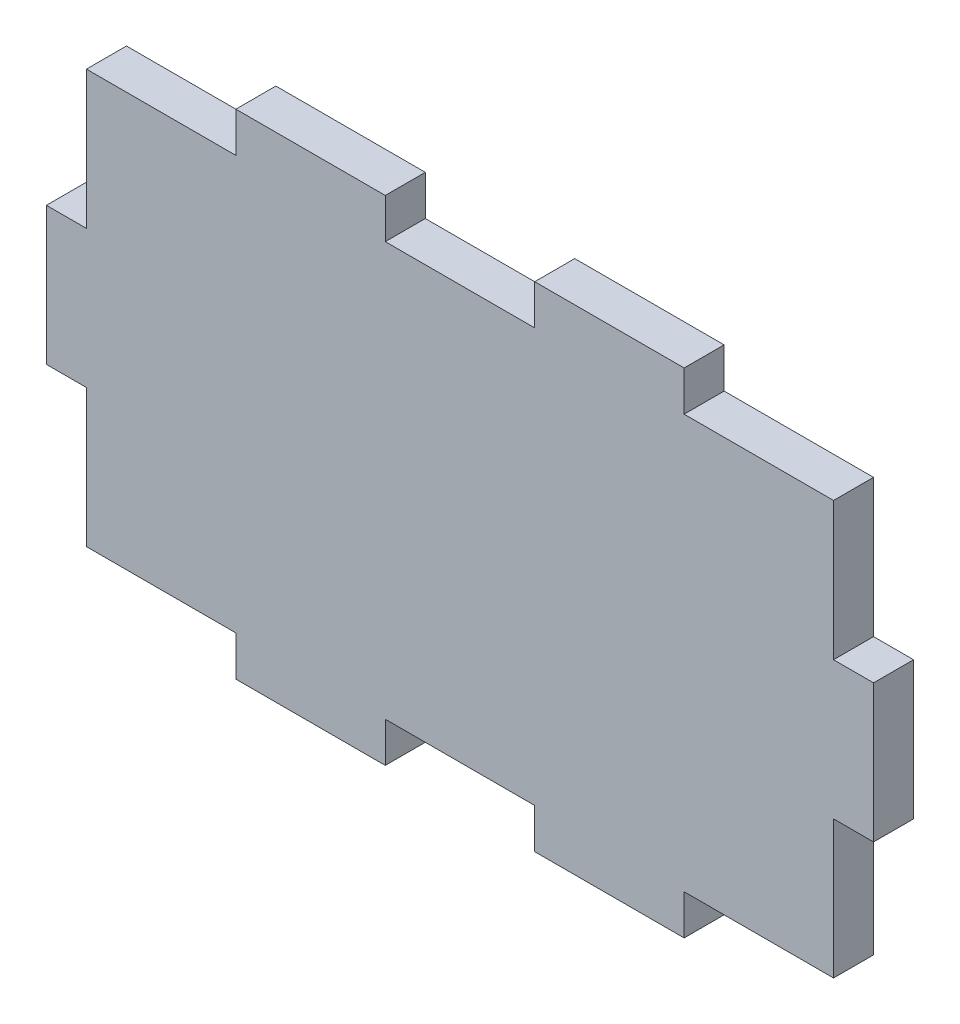
ISO-10303-21;
HEADER;
FILE_DESCRIPTION(('STEP AP214'),'2;1');
FILE_NAME('part.step','',(''),(''),'','','');
FILE_SCHEMA(('AUTOMOTIVE_DESIGN { 1 0 10303 214 1 1 1 1 }'));
ENDSEC;
DATA;
#1=APPLICATION_CONTEXT('core data for automotive mechanical design processes');
#2=APPLICATION_PROTOCOL_DEFINITION('international standard','automotive_design',2000,#1);
#3=PRODUCT_CONTEXT('',#1,'mechanical');
#4=PRODUCT('Part','Part','',(#3));
#5=PRODUCT_RELATED_PRODUCT_CATEGORY('part','',(#4));
#6=PRODUCT_DEFINITION_FORMATION('','',#4);
#7=PRODUCT_DEFINITION_CONTEXT('part definition',#1,'design');
#8=PRODUCT_DEFINITION('design','',#6,#7);
#9=PRODUCT_DEFINITION_SHAPE('','',#8);
#10=(LENGTH_UNIT() NAMED_UNIT(*) SI_UNIT(.MILLI.,.METRE.));
#11=(NAMED_UNIT(*) PLANE_ANGLE_UNIT() SI_UNIT($,.RADIAN.));
#12=(NAMED_UNIT(*) SI_UNIT($,.STERADIAN.) SOLID_ANGLE_UNIT());
#13=UNCERTAINTY_MEASURE_WITH_UNIT(LENGTH_MEASURE(1.E-05),#10,'distance_accuracy_value','');
#14=(GEOMETRIC_REPRESENTATION_CONTEXT(3) GLOBAL_UNCERTAINTY_ASSIGNED_CONTEXT((#13)) GLOBAL_UNIT_ASSIGNED_CONTEXT((#10,
#11,#12)) REPRESENTATION_CONTEXT('',''));
#15=CARTESIAN_POINT('',(0.,0.,0.));
#16=DIRECTION('',(0.,0.,1.));
#17=DIRECTION('',(1.,0.,0.));
#18=AXIS2_PLACEMENT_3D('',#15,#16,#17);
#19=CARTESIAN_POINT('',(0.,34.,3.));
#20=DIRECTION('',(0.,1.,0.));
#21=DIRECTION('',(0.,0.,1.));
#22=AXIS2_PLACEMENT_3D('',#19,#20,#21);
#23=PLANE('',#22);
#24=DIRECTION('',(1.,0.,0.));
#25=VECTOR('',#24,1.);
#26=CARTESIAN_POINT('',(0.,34.,0.));
#27=LINE('',#26,#25);
#28=CARTESIAN_POINT('',(33.6,34.,0.));
#29=VERTEX_POINT('',#28);
#30=CARTESIAN_POINT('',(44.8,34.,0.));
#31=VERTEX_POINT('',#30);
#32=EDGE_CURVE('E473',#29,#31,#27,.T.);
#33=ORIENTED_EDGE('',*,*,#32,.F.);
#34=DIRECTION('',(0.,0.,-1.));
#35=VECTOR('',#34,1.);
#36=CARTESIAN_POINT('',(33.6,34.,3.));
#37=LINE('',#36,#35);
#38=CARTESIAN_POINT('',(33.6,34.,3.));
#39=VERTEX_POINT('',#38);
#40=EDGE_CURVE('E499',#39,#29,#37,.T.);
#41=ORIENTED_EDGE('',*,*,#40,.F.);
#42=DIRECTION('',(1.,0.,0.));
#43=VECTOR('',#42,1.);
#44=CARTESIAN_POINT('',(0.,34.,3.));
#45=LINE('',#44,#43);
#46=CARTESIAN_POINT('',(44.8,34.,3.));
#47=VERTEX_POINT('',#46);
#48=EDGE_CURVE('E610',#39,#47,#45,.T.);
#49=ORIENTED_EDGE('',*,*,#48,.T.);
#50=DIRECTION('',(0.,0.,-1.));
#51=VECTOR('',#50,1.);
#52=CARTESIAN_POINT('',(44.8,34.,3.));
#53=LINE('',#52,#51);
#54=EDGE_CURVE('E501',#47,#31,#53,.T.);
#55=ORIENTED_EDGE('',*,*,#54,.T.);
#56=EDGE_LOOP('',(#33,#41,#49,#55));
#57=FACE_BOUND('',#56,.T.);
#58=ADVANCED_FACE('F203',(#57),#23,.T.);
#59=CARTESIAN_POINT('',(0.,0.,0.));
#60=DIRECTION('',(0.,0.,1.));
#61=DIRECTION('',(1.,0.,0.));
#62=AXIS2_PLACEMENT_3D('',#59,#60,#61);
#63=PLANE('',#62);
#64=DIRECTION('',(0.,1.,0.));
#65=VECTOR('',#64,1.);
#66=CARTESIAN_POINT('',(0.,0.,0.));
#67=LINE('',#66,#65);
#68=CARTESIAN_POINT('',(0.,20.66,0.));
#69=VERTEX_POINT('',#68);
#70=CARTESIAN_POINT('',(0.,31.,0.));
#71=VERTEX_POINT('',#70);
#72=EDGE_CURVE('E418',#69,#71,#67,.T.);
#73=ORIENTED_EDGE('',*,*,#72,.T.);
#74=DIRECTION('',(1.,0.,0.));
#75=VECTOR('',#74,1.);
#76=CARTESIAN_POINT('',(0.,31.,0.));
#77=LINE('',#76,#75);
#78=CARTESIAN_POINT('',(11.2,31.,0.));
#79=VERTEX_POINT('',#78);
#80=EDGE_CURVE('E488',#71,#79,#77,.T.);
#81=ORIENTED_EDGE('',*,*,#80,.T.);
#82=DIRECTION('',(0.,1.,0.));
#83=VECTOR('',#82,1.);
#84=CARTESIAN_POINT('',(11.2,0.,0.));
#85=LINE('',#84,#83);
#86=CARTESIAN_POINT('',(11.2,34.,0.));
#87=VERTEX_POINT('',#86);
#88=EDGE_CURVE('E486',#79,#87,#85,.T.);
#89=ORIENTED_EDGE('',*,*,#88,.T.);
#90=DIRECTION('',(1.,0.,0.));
#91=VECTOR('',#90,1.);
#92=CARTESIAN_POINT('',(0.,34.,0.));
#93=LINE('',#92,#91);
#94=CARTESIAN_POINT('',(22.4,34.,0.));
#95=VERTEX_POINT('',#94);
#96=EDGE_CURVE('E395',#87,#95,#93,.T.);
#97=ORIENTED_EDGE('',*,*,#96,.T.);
#98=DIRECTION('',(0.,1.,0.));
#99=VECTOR('',#98,1.);
#100=CARTESIAN_POINT('',(22.4,0.,0.));
#101=LINE('',#100,#99);
#102=CARTESIAN_POINT('',(22.4,31.,0.));
#103=VERTEX_POINT('',#102);
#104=EDGE_CURVE('E482',#103,#95,#101,.T.);
#105=ORIENTED_EDGE('',*,*,#104,.F.);
#106=DIRECTION('',(1.,0.,0.));
#107=VECTOR('',#106,1.);
#108=CARTESIAN_POINT('',(0.,31.,0.));
#109=LINE('',#108,#107);
#110=CARTESIAN_POINT('',(33.6,31.,0.));
#111=VERTEX_POINT('',#110);
#112=EDGE_CURVE('E479',#103,#111,#109,.T.);
#113=ORIENTED_EDGE('',*,*,#112,.T.);
#114=DIRECTION('',(0.,1.,0.));
#115=VECTOR('',#114,1.);
#116=CARTESIAN_POINT('',(33.6,0.,0.));
#117=LINE('',#116,#115);
#118=EDGE_CURVE('E476',#111,#29,#117,.T.);
#119=ORIENTED_EDGE('',*,*,#118,.T.);
#120=ORIENTED_EDGE('',*,*,#32,.T.);
#121=DIRECTION('',(0.,1.,0.));
#122=VECTOR('',#121,1.);
#123=CARTESIAN_POINT('',(44.8,0.,0.));
#124=LINE('',#123,#122);
#125=CARTESIAN_POINT('',(44.8,31.,0.));
#126=VERTEX_POINT('',#125);
#127=EDGE_CURVE('E470',#126,#31,#124,.T.);
#128=ORIENTED_EDGE('',*,*,#127,.F.);
#129=DIRECTION('',(1.,0.,0.));
#130=VECTOR('',#129,1.);
#131=CARTESIAN_POINT('',(0.,31.,0.));
#132=LINE('',#131,#130);
#133=CARTESIAN_POINT('',(56.,31.,0.));
#134=VERTEX_POINT('',#133);
#135=EDGE_CURVE('E467',#126,#134,#132,.T.);
#136=ORIENTED_EDGE('',*,*,#135,.T.);
#137=DIRECTION('',(0.,1.,0.));
#138=VECTOR('',#137,1.);
#139=CARTESIAN_POINT('',(56.,0.,0.));
#140=LINE('',#139,#138);
#141=CARTESIAN_POINT('',(56.,20.66,0.));
#142=VERTEX_POINT('',#141);
#143=EDGE_CURVE('E464',#142,#134,#140,.T.);
#144=ORIENTED_EDGE('',*,*,#143,.F.);
#145=DIRECTION('',(1.,0.,0.));
#146=VECTOR('',#145,1.);
#147=CARTESIAN_POINT('',(0.,20.66,0.));
#148=LINE('',#147,#146);
#149=CARTESIAN_POINT('',(59.,20.66,0.));
#150=VERTEX_POINT('',#149);
#151=EDGE_CURVE('E461',#142,#150,#148,.T.);
#152=ORIENTED_EDGE('',*,*,#151,.T.);
#153=DIRECTION('',(0.,-1.,0.));
#154=VECTOR('',#153,1.);
#155=CARTESIAN_POINT('',(59.,0.,0.));
#156=LINE('',#155,#154);
#157=CARTESIAN_POINT('',(59.,10.33,0.));
#158=VERTEX_POINT('',#157);
#159=EDGE_CURVE('E458',#150,#158,#156,.T.);
#160=ORIENTED_EDGE('',*,*,#159,.T.);
#161=DIRECTION('',(1.,0.,0.));
#162=VECTOR('',#161,1.);
#163=CARTESIAN_POINT('',(0.,10.33,0.));
#164=LINE('',#163,#162);
#165=CARTESIAN_POINT('',(56.,10.33,0.));
#166=VERTEX_POINT('',#165);
#167=EDGE_CURVE('E455',#166,#158,#164,.T.);
#168=ORIENTED_EDGE('',*,*,#167,.F.);
#169=DIRECTION('',(0.,1.,0.));
#170=VECTOR('',#169,1.);
#171=CARTESIAN_POINT('',(56.,0.,0.));
#172=LINE('',#171,#170);
#173=CARTESIAN_POINT('',(56.,0.,0.));
#174=VERTEX_POINT('',#173);
#175=EDGE_CURVE('E453',#174,#166,#172,.T.);
#176=ORIENTED_EDGE('',*,*,#175,.F.);
#177=DIRECTION('',(1.,0.,0.));
#178=VECTOR('',#177,1.);
#179=CARTESIAN_POINT('',(0.,0.,0.));
#180=LINE('',#179,#178);
#181=CARTESIAN_POINT('',(44.8,0.,0.));
#182=VERTEX_POINT('',#181);
#183=EDGE_CURVE('E451',#182,#174,#180,.T.);
#184=ORIENTED_EDGE('',*,*,#183,.F.);
#185=DIRECTION('',(0.,-1.,0.));
#186=VECTOR('',#185,1.);
#187=CARTESIAN_POINT('',(44.8,0.,0.));
#188=LINE('',#187,#186);
#189=CARTESIAN_POINT('',(44.8,-3.,0.));
#190=VERTEX_POINT('',#189);
#191=EDGE_CURVE('E448',#182,#190,#188,.T.);
#192=ORIENTED_EDGE('',*,*,#191,.T.);
#193=DIRECTION('',(1.,0.,0.));
#194=VECTOR('',#193,1.);
#195=CARTESIAN_POINT('',(0.,-3.,0.));
#196=LINE('',#195,#194);
#197=CARTESIAN_POINT('',(33.6,-3.,0.));
#198=VERTEX_POINT('',#197);
#199=EDGE_CURVE('E445',#198,#190,#196,.T.);
#200=ORIENTED_EDGE('',*,*,#199,.F.);
#201=DIRECTION('',(0.,-1.,0.));
#202=VECTOR('',#201,1.);
#203=CARTESIAN_POINT('',(33.6,0.,0.));
#204=LINE('',#203,#202);
#205=CARTESIAN_POINT('',(33.6,0.,0.));
#206=VERTEX_POINT('',#205);
#207=EDGE_CURVE('E443',#206,#198,#204,.T.);
#208=ORIENTED_EDGE('',*,*,#207,.F.);
#209=DIRECTION('',(1.,0.,0.));
#210=VECTOR('',#209,1.);
#211=CARTESIAN_POINT('',(0.,0.,0.));
#212=LINE('',#211,#210);
#213=CARTESIAN_POINT('',(22.4,0.,0.));
#214=VERTEX_POINT('',#213);
#215=EDGE_CURVE('E441',#214,#206,#212,.T.);
#216=ORIENTED_EDGE('',*,*,#215,.F.);
#217=DIRECTION('',(0.,-1.,0.));
#218=VECTOR('',#217,1.);
#219=CARTESIAN_POINT('',(22.4,0.,0.));
#220=LINE('',#219,#218);
#221=CARTESIAN_POINT('',(22.4,-3.,0.));
#222=VERTEX_POINT('',#221);
#223=EDGE_CURVE('E438',#214,#222,#220,.T.);
#224=ORIENTED_EDGE('',*,*,#223,.T.);
#225=DIRECTION('',(1.,0.,0.));
#226=VECTOR('',#225,1.);
#227=CARTESIAN_POINT('',(0.,-3.,0.));
#228=LINE('',#227,#226);
#229=CARTESIAN_POINT('',(11.2,-3.,0.));
#230=VERTEX_POINT('',#229);
#231=EDGE_CURVE('E435',#230,#222,#228,.T.);
#232=ORIENTED_EDGE('',*,*,#231,.F.);
#233=DIRECTION('',(0.,-1.,0.));
#234=VECTOR('',#233,1.);
#235=CARTESIAN_POINT('',(11.2,0.,0.));
#236=LINE('',#235,#234);
#237=CARTESIAN_POINT('',(11.2,0.,0.));
#238=VERTEX_POINT('',#237);
#239=EDGE_CURVE('E433',#238,#230,#236,.T.);
#240=ORIENTED_EDGE('',*,*,#239,.F.);
#241=DIRECTION('',(1.,0.,0.));
#242=VECTOR('',#241,1.);
#243=CARTESIAN_POINT('',(0.,0.,0.));
#244=LINE('',#243,#242);
#245=CARTESIAN_POINT('',(0.,0.,0.));
#246=VERTEX_POINT('',#245);
#247=EDGE_CURVE('E431',#246,#238,#244,.T.);
#248=ORIENTED_EDGE('',*,*,#247,.F.);
#249=DIRECTION('',(0.,1.,0.));
#250=VECTOR('',#249,1.);
#251=CARTESIAN_POINT('',(0.,0.,0.));
#252=LINE('',#251,#250);
#253=CARTESIAN_POINT('',(0.,10.33,0.));
#254=VERTEX_POINT('',#253);
#255=EDGE_CURVE('E428',#246,#254,#252,.T.);
#256=ORIENTED_EDGE('',*,*,#255,.T.);
#257=DIRECTION('',(-1.,0.,0.));
#258=VECTOR('',#257,1.);
#259=CARTESIAN_POINT('',(0.,10.33,0.));
#260=LINE('',#259,#258);
#261=CARTESIAN_POINT('',(-3.,10.33,0.));
#262=VERTEX_POINT('',#261);
#263=EDGE_CURVE('E425',#254,#262,#260,.T.);
#264=ORIENTED_EDGE('',*,*,#263,.T.);
#265=DIRECTION('',(0.,-1.,0.));
#266=VECTOR('',#265,1.);
#267=CARTESIAN_POINT('',(-3.,0.,0.));
#268=LINE('',#267,#266);
#269=CARTESIAN_POINT('',(-3.,20.66,0.));
#270=VERTEX_POINT('',#269);
#271=EDGE_CURVE('E422',#270,#262,#268,.T.);
#272=ORIENTED_EDGE('',*,*,#271,.F.);
#273=DIRECTION('',(-1.,0.,0.));
#274=VECTOR('',#273,1.);
#275=CARTESIAN_POINT('',(0.,20.66,0.));
#276=LINE('',#275,#274);
#277=EDGE_CURVE('E420',#69,#270,#276,.T.);
#278=ORIENTED_EDGE('',*,*,#277,.F.);
#279=EDGE_LOOP('',(#73,#81,#89,#97,#105,#113,#119,#120,#128,#136,#144,#152,#160,#168,#176,#184,
#192,#200,#208,#216,#224,#232,#240,#248,#256,#264,#272,#278));
#280=FACE_BOUND('',#279,.T.);
#281=ADVANCED_FACE('F555',(#280),#63,.F.);
#282=CARTESIAN_POINT('',(44.8,0.,3.));
#283=DIRECTION('',(-1.,0.,0.));
#284=DIRECTION('',(0.,0.,1.));
#285=AXIS2_PLACEMENT_3D('',#282,#283,#284);
#286=PLANE('',#285);
#287=ORIENTED_EDGE('',*,*,#127,.T.);
#288=ORIENTED_EDGE('',*,*,#54,.F.);
#289=DIRECTION('',(0.,1.,0.));
#290=VECTOR('',#289,1.);
#291=CARTESIAN_POINT('',(44.8,0.,3.));
#292=LINE('',#291,#290);
#293=CARTESIAN_POINT('',(44.8,31.,3.));
#294=VERTEX_POINT('',#293);
#295=EDGE_CURVE('E608',#294,#47,#292,.T.);
#296=ORIENTED_EDGE('',*,*,#295,.F.);
#297=DIRECTION('',(0.,0.,-1.));
#298=VECTOR('',#297,1.);
#299=CARTESIAN_POINT('',(44.8,31.,3.));
#300=LINE('',#299,#298);
#301=EDGE_CURVE('E503',#294,#126,#300,.T.);
#302=ORIENTED_EDGE('',*,*,#301,.T.);
#303=EDGE_LOOP('',(#287,#288,#296,#302));
#304=FACE_BOUND('',#303,.T.);
#305=ADVANCED_FACE('F639',(#304),#286,.F.);
#306=CARTESIAN_POINT('',(0.,31.,3.));
#307=DIRECTION('',(0.,1.,0.));
#308=DIRECTION('',(0.,0.,1.));
#309=AXIS2_PLACEMENT_3D('',#306,#307,#308);
#310=PLANE('',#309);
#311=ORIENTED_EDGE('',*,*,#135,.F.);
#312=ORIENTED_EDGE('',*,*,#301,.F.);
#313=DIRECTION('',(1.,0.,0.));
#314=VECTOR('',#313,1.);
#315=CARTESIAN_POINT('',(0.,31.,3.));
#316=LINE('',#315,#314);
#317=CARTESIAN_POINT('',(56.,31.,3.));
#318=VERTEX_POINT('',#317);
#319=EDGE_CURVE('E605',#294,#318,#316,.T.);
#320=ORIENTED_EDGE('',*,*,#319,.T.);
#321=DIRECTION('',(0.,0.,-1.));
#322=VECTOR('',#321,1.);
#323=CARTESIAN_POINT('',(56.,31.,3.));
#324=LINE('',#323,#322);
#325=EDGE_CURVE('E505',#318,#134,#324,.T.);
#326=ORIENTED_EDGE('',*,*,#325,.T.);
#327=EDGE_LOOP('',(#311,#312,#320,#326));
#328=FACE_BOUND('',#327,.T.);
#329=ADVANCED_FACE('F645',(#328),#310,.T.);
#330=CARTESIAN_POINT('',(56.,0.,3.));
#331=DIRECTION('',(-1.,0.,0.));
#332=DIRECTION('',(0.,0.,1.));
#333=AXIS2_PLACEMENT_3D('',#330,#331,#332);
#334=PLANE('',#333);
#335=ORIENTED_EDGE('',*,*,#143,.T.);
#336=ORIENTED_EDGE('',*,*,#325,.F.);
#337=DIRECTION('',(0.,1.,0.));
#338=VECTOR('',#337,1.);
#339=CARTESIAN_POINT('',(56.,0.,3.));
#340=LINE('',#339,#338);
#341=CARTESIAN_POINT('',(56.,20.66,3.));
#342=VERTEX_POINT('',#341);
#343=EDGE_CURVE('E603',#342,#318,#340,.T.);
#344=ORIENTED_EDGE('',*,*,#343,.F.);
#345=DIRECTION('',(0.,0.,-1.));
#346=VECTOR('',#345,1.);
#347=CARTESIAN_POINT('',(56.,20.66,3.));
#348=LINE('',#347,#346);
#349=EDGE_CURVE('E507',#342,#142,#348,.T.);
#350=ORIENTED_EDGE('',*,*,#349,.T.);
#351=EDGE_LOOP('',(#335,#336,#344,#350));
#352=FACE_BOUND('',#351,.T.);
#353=ADVANCED_FACE('F718',(#352),#334,.F.);
#354=CARTESIAN_POINT('',(0.,20.66,3.));
#355=DIRECTION('',(0.,1.,0.));
#356=DIRECTION('',(0.,0.,1.));
#357=AXIS2_PLACEMENT_3D('',#354,#355,#356);
#358=PLANE('',#357);
#359=ORIENTED_EDGE('',*,*,#151,.F.);
#360=ORIENTED_EDGE('',*,*,#349,.F.);
#361=DIRECTION('',(1.,0.,0.));
#362=VECTOR('',#361,1.);
#363=CARTESIAN_POINT('',(0.,20.66,3.));
#364=LINE('',#363,#362);
#365=CARTESIAN_POINT('',(59.,20.66,3.));
#366=VERTEX_POINT('',#365);
#367=EDGE_CURVE('E600',#342,#366,#364,.T.);
#368=ORIENTED_EDGE('',*,*,#367,.T.);
#369=DIRECTION('',(0.,0.,-1.));
#370=VECTOR('',#369,1.);
#371=CARTESIAN_POINT('',(59.,20.66,3.));
#372=LINE('',#371,#370);
#373=EDGE_CURVE('E509',#366,#150,#372,.T.);
#374=ORIENTED_EDGE('',*,*,#373,.T.);
#375=EDGE_LOOP('',(#359,#360,#368,#374));
#376=FACE_BOUND('',#375,.T.);
#377=ADVANCED_FACE('F722',(#376),#358,.T.);
#378=CARTESIAN_POINT('',(59.,0.,3.));
#379=DIRECTION('',(1.,0.,0.));
#380=DIRECTION('',(0.,0.,-1.));
#381=AXIS2_PLACEMENT_3D('',#378,#379,#380);
#382=PLANE('',#381);
#383=ORIENTED_EDGE('',*,*,#159,.F.);
#384=ORIENTED_EDGE('',*,*,#373,.F.);
#385=DIRECTION('',(0.,-1.,0.));
#386=VECTOR('',#385,1.);
#387=CARTESIAN_POINT('',(59.,0.,3.));
#388=LINE('',#387,#386);
#389=CARTESIAN_POINT('',(59.,10.33,3.));
#390=VERTEX_POINT('',#389);
#391=EDGE_CURVE('E597',#366,#390,#388,.T.);
#392=ORIENTED_EDGE('',*,*,#391,.T.);
#393=DIRECTION('',(0.,0.,-1.));
#394=VECTOR('',#393,1.);
#395=CARTESIAN_POINT('',(59.,10.33,3.));
#396=LINE('',#395,#394);
#397=EDGE_CURVE('E511',#390,#158,#396,.T.);
#398=ORIENTED_EDGE('',*,*,#397,.T.);
#399=EDGE_LOOP('',(#383,#384,#392,#398));
#400=FACE_BOUND('',#399,.T.);
#401=ADVANCED_FACE('F726',(#400),#382,.T.);
#402=CARTESIAN_POINT('',(0.,10.33,3.));
#403=DIRECTION('',(0.,1.,0.));
#404=DIRECTION('',(0.,0.,1.));
#405=AXIS2_PLACEMENT_3D('',#402,#403,#404);
#406=PLANE('',#405);
#407=ORIENTED_EDGE('',*,*,#167,.T.);
#408=ORIENTED_EDGE('',*,*,#397,.F.);
#409=DIRECTION('',(1.,0.,0.));
#410=VECTOR('',#409,1.);
#411=CARTESIAN_POINT('',(0.,10.33,3.));
#412=LINE('',#411,#410);
#413=CARTESIAN_POINT('',(56.,10.33,3.));
#414=VERTEX_POINT('',#413);
#415=EDGE_CURVE('E595',#414,#390,#412,.T.);
#416=ORIENTED_EDGE('',*,*,#415,.F.);
#417=DIRECTION('',(0.,0.,-1.));
#418=VECTOR('',#417,1.);
#419=CARTESIAN_POINT('',(56.,10.33,3.));
#420=LINE('',#419,#418);
#421=EDGE_CURVE('E513',#414,#166,#420,.T.);
#422=ORIENTED_EDGE('',*,*,#421,.T.);
#423=EDGE_LOOP('',(#407,#408,#416,#422));
#424=FACE_BOUND('',#423,.T.);
#425=ADVANCED_FACE('F730',(#424),#406,.F.);
#426=CARTESIAN_POINT('',(56.,0.,3.));
#427=DIRECTION('',(-1.,0.,0.));
#428=DIRECTION('',(0.,0.,1.));
#429=AXIS2_PLACEMENT_3D('',#426,#427,#428);
#430=PLANE('',#429);
#431=ORIENTED_EDGE('',*,*,#175,.T.);
#432=ORIENTED_EDGE('',*,*,#421,.F.);
#433=DIRECTION('',(0.,1.,0.));
#434=VECTOR('',#433,1.);
#435=CARTESIAN_POINT('',(56.,0.,3.));
#436=LINE('',#435,#434);
#437=CARTESIAN_POINT('',(56.,0.,3.));
#438=VERTEX_POINT('',#437);
#439=EDGE_CURVE('E593',#438,#414,#436,.T.);
#440=ORIENTED_EDGE('',*,*,#439,.F.);
#441=DIRECTION('',(0.,0.,-1.));
#442=VECTOR('',#441,1.);
#443=CARTESIAN_POINT('',(56.,0.,3.));
#444=LINE('',#443,#442);
#445=EDGE_CURVE('E516',#438,#174,#444,.T.);
#446=ORIENTED_EDGE('',*,*,#445,.T.);
#447=EDGE_LOOP('',(#431,#432,#440,#446));
#448=FACE_BOUND('',#447,.T.);
#449=ADVANCED_FACE('F734',(#448),#430,.F.);
#450=CARTESIAN_POINT('',(0.,0.,3.));
#451=DIRECTION('',(0.,1.,0.));
#452=DIRECTION('',(-1.,0.,0.));
#453=AXIS2_PLACEMENT_3D('',#450,#451,#452);
#454=PLANE('',#453);
#455=ORIENTED_EDGE('',*,*,#183,.T.);
#456=ORIENTED_EDGE('',*,*,#445,.F.);
#457=DIRECTION('',(1.,0.,0.));
#458=VECTOR('',#457,1.);
#459=CARTESIAN_POINT('',(0.,0.,3.));
#460=LINE('',#459,#458);
#461=CARTESIAN_POINT('',(44.8,0.,3.));
#462=VERTEX_POINT('',#461);
#463=EDGE_CURVE('E591',#462,#438,#460,.T.);
#464=ORIENTED_EDGE('',*,*,#463,.F.);
#465=DIRECTION('',(0.,0.,-1.));
#466=VECTOR('',#465,1.);
#467=CARTESIAN_POINT('',(44.8,0.,3.));
#468=LINE('',#467,#466);
#469=EDGE_CURVE('E519',#462,#182,#468,.T.);
#470=ORIENTED_EDGE('',*,*,#469,.T.);
#471=EDGE_LOOP('',(#455,#456,#464,#470));
#472=FACE_BOUND('',#471,.T.);
#473=ADVANCED_FACE('F738',(#472),#454,.F.);
#474=CARTESIAN_POINT('',(44.8,0.,3.));
#475=DIRECTION('',(1.,0.,0.));
#476=DIRECTION('',(0.,0.,-1.));
#477=AXIS2_PLACEMENT_3D('',#474,#475,#476);
#478=PLANE('',#477);
#479=ORIENTED_EDGE('',*,*,#191,.F.);
#480=ORIENTED_EDGE('',*,*,#469,.F.);
#481=DIRECTION('',(0.,-1.,0.));
#482=VECTOR('',#481,1.);
#483=CARTESIAN_POINT('',(44.8,0.,3.));
#484=LINE('',#483,#482);
#485=CARTESIAN_POINT('',(44.8,-3.,3.));
#486=VERTEX_POINT('',#485);
#487=EDGE_CURVE('E588',#462,#486,#484,.T.);
#488=ORIENTED_EDGE('',*,*,#487,.T.);
#489=DIRECTION('',(0.,0.,-1.));
#490=VECTOR('',#489,1.);
#491=CARTESIAN_POINT('',(44.8,-3.,3.));
#492=LINE('',#491,#490);
#493=EDGE_CURVE('E521',#486,#190,#492,.T.);
#494=ORIENTED_EDGE('',*,*,#493,.T.);
#495=EDGE_LOOP('',(#479,#480,#488,#494));
#496=FACE_BOUND('',#495,.T.);
#497=ADVANCED_FACE('F742',(#496),#478,.T.);
#498=CARTESIAN_POINT('',(0.,-3.,3.));
#499=DIRECTION('',(0.,1.,0.));
#500=DIRECTION('',(0.,0.,1.));
#501=AXIS2_PLACEMENT_3D('',#498,#499,#500);
#502=PLANE('',#501);
#503=ORIENTED_EDGE('',*,*,#199,.T.);
#504=ORIENTED_EDGE('',*,*,#493,.F.);
#505=DIRECTION('',(1.,0.,0.));
#506=VECTOR('',#505,1.);
#507=CARTESIAN_POINT('',(0.,-3.,3.));
#508=LINE('',#507,#506);
#509=CARTESIAN_POINT('',(33.6,-3.,3.));
#510=VERTEX_POINT('',#509);
#511=EDGE_CURVE('E586',#510,#486,#508,.T.);
#512=ORIENTED_EDGE('',*,*,#511,.F.);
#513=DIRECTION('',(0.,0.,-1.));
#514=VECTOR('',#513,1.);
#515=CARTESIAN_POINT('',(33.6,-3.,3.));
#516=LINE('',#515,#514);
#517=EDGE_CURVE('E523',#510,#198,#516,.T.);
#518=ORIENTED_EDGE('',*,*,#517,.T.);
#519=EDGE_LOOP('',(#503,#504,#512,#518));
#520=FACE_BOUND('',#519,.T.);
#521=ADVANCED_FACE('F746',(#520),#502,.F.);
#522=CARTESIAN_POINT('',(33.6,0.,3.));
#523=DIRECTION('',(1.,0.,0.));
#524=DIRECTION('',(0.,0.,-1.));
#525=AXIS2_PLACEMENT_3D('',#522,#523,#524);
#526=PLANE('',#525);
#527=ORIENTED_EDGE('',*,*,#207,.T.);
#528=ORIENTED_EDGE('',*,*,#517,.F.);
#529=DIRECTION('',(0.,-1.,0.));
#530=VECTOR('',#529,1.);
#531=CARTESIAN_POINT('',(33.6,0.,3.));
#532=LINE('',#531,#530);
#533=CARTESIAN_POINT('',(33.6,0.,3.));
#534=VERTEX_POINT('',#533);
#535=EDGE_CURVE('E584',#534,#510,#532,.T.);
#536=ORIENTED_EDGE('',*,*,#535,.F.);
#537=DIRECTION('',(0.,0.,-1.));
#538=VECTOR('',#537,1.);
#539=CARTESIAN_POINT('',(33.6,0.,3.));
#540=LINE('',#539,#538);
#541=EDGE_CURVE('E526',#534,#206,#540,.T.);
#542=ORIENTED_EDGE('',*,*,#541,.T.);
#543=EDGE_LOOP('',(#527,#528,#536,#542));
#544=FACE_BOUND('',#543,.T.);
#545=ADVANCED_FACE('F750',(#544),#526,.F.);
#546=CARTESIAN_POINT('',(0.,0.,3.));
#547=DIRECTION('',(0.,1.,0.));
#548=DIRECTION('',(-1.,0.,0.));
#549=AXIS2_PLACEMENT_3D('',#546,#547,#548);
#550=PLANE('',#549);
#551=ORIENTED_EDGE('',*,*,#215,.T.);
#552=ORIENTED_EDGE('',*,*,#541,.F.);
#553=DIRECTION('',(1.,0.,0.));
#554=VECTOR('',#553,1.);
#555=CARTESIAN_POINT('',(0.,0.,3.));
#556=LINE('',#555,#554);
#557=CARTESIAN_POINT('',(22.4,0.,3.));
#558=VERTEX_POINT('',#557);
#559=EDGE_CURVE('E582',#558,#534,#556,.T.);
#560=ORIENTED_EDGE('',*,*,#559,.F.);
#561=DIRECTION('',(0.,0.,-1.));
#562=VECTOR('',#561,1.);
#563=CARTESIAN_POINT('',(22.4,0.,3.));
#564=LINE('',#563,#562);
#565=EDGE_CURVE('E529',#558,#214,#564,.T.);
#566=ORIENTED_EDGE('',*,*,#565,.T.);
#567=EDGE_LOOP('',(#551,#552,#560,#566));
#568=FACE_BOUND('',#567,.T.);
#569=ADVANCED_FACE('F754',(#568),#550,.F.);
#570=CARTESIAN_POINT('',(22.4,0.,3.));
#571=DIRECTION('',(1.,0.,0.));
#572=DIRECTION('',(0.,0.,-1.));
#573=AXIS2_PLACEMENT_3D('',#570,#571,#572);
#574=PLANE('',#573);
#575=ORIENTED_EDGE('',*,*,#223,.F.);
#576=ORIENTED_EDGE('',*,*,#565,.F.);
#577=DIRECTION('',(0.,-1.,0.));
#578=VECTOR('',#577,1.);
#579=CARTESIAN_POINT('',(22.4,0.,3.));
#580=LINE('',#579,#578);
#581=CARTESIAN_POINT('',(22.4,-3.,3.));
#582=VERTEX_POINT('',#581);
#583=EDGE_CURVE('E579',#558,#582,#580,.T.);
#584=ORIENTED_EDGE('',*,*,#583,.T.);
#585=DIRECTION('',(0.,0.,-1.));
#586=VECTOR('',#585,1.);
#587=CARTESIAN_POINT('',(22.4,-3.,3.));
#588=LINE('',#587,#586);
#589=EDGE_CURVE('E531',#582,#222,#588,.T.);
#590=ORIENTED_EDGE('',*,*,#589,.T.);
#591=EDGE_LOOP('',(#575,#576,#584,#590));
#592=FACE_BOUND('',#591,.T.);
#593=ADVANCED_FACE('F758',(#592),#574,.T.);
#594=CARTESIAN_POINT('',(0.,-3.,3.));
#595=DIRECTION('',(0.,1.,0.));
#596=DIRECTION('',(0.,0.,1.));
#597=AXIS2_PLACEMENT_3D('',#594,#595,#596);
#598=PLANE('',#597);
#599=ORIENTED_EDGE('',*,*,#231,.T.);
#600=ORIENTED_EDGE('',*,*,#589,.F.);
#601=DIRECTION('',(1.,0.,0.));
#602=VECTOR('',#601,1.);
#603=CARTESIAN_POINT('',(0.,-3.,3.));
#604=LINE('',#603,#602);
#605=CARTESIAN_POINT('',(11.2,-3.,3.));
#606=VERTEX_POINT('',#605);
#607=EDGE_CURVE('E577',#606,#582,#604,.T.);
#608=ORIENTED_EDGE('',*,*,#607,.F.);
#609=DIRECTION('',(0.,0.,-1.));
#610=VECTOR('',#609,1.);
#611=CARTESIAN_POINT('',(11.2,-3.,3.));
#612=LINE('',#611,#610);
#613=EDGE_CURVE('E533',#606,#230,#612,.T.);
#614=ORIENTED_EDGE('',*,*,#613,.T.);
#615=EDGE_LOOP('',(#599,#600,#608,#614));
#616=FACE_BOUND('',#615,.T.);
#617=ADVANCED_FACE('F762',(#616),#598,.F.);
#618=CARTESIAN_POINT('',(11.2,0.,3.));
#619=DIRECTION('',(1.,0.,0.));
#620=DIRECTION('',(0.,0.,-1.));
#621=AXIS2_PLACEMENT_3D('',#618,#619,#620);
#622=PLANE('',#621);
#623=ORIENTED_EDGE('',*,*,#239,.T.);
#624=ORIENTED_EDGE('',*,*,#613,.F.);
#625=DIRECTION('',(0.,-1.,0.));
#626=VECTOR('',#625,1.);
#627=CARTESIAN_POINT('',(11.2,0.,3.));
#628=LINE('',#627,#626);
#629=CARTESIAN_POINT('',(11.2,0.,3.));
#630=VERTEX_POINT('',#629);
#631=EDGE_CURVE('E575',#630,#606,#628,.T.);
#632=ORIENTED_EDGE('',*,*,#631,.F.);
#633=DIRECTION('',(0.,0.,-1.));
#634=VECTOR('',#633,1.);
#635=CARTESIAN_POINT('',(11.2,0.,3.));
#636=LINE('',#635,#634);
#637=EDGE_CURVE('E536',#630,#238,#636,.T.);
#638=ORIENTED_EDGE('',*,*,#637,.T.);
#639=EDGE_LOOP('',(#623,#624,#632,#638));
#640=FACE_BOUND('',#639,.T.);
#641=ADVANCED_FACE('F766',(#640),#622,.F.);
#642=CARTESIAN_POINT('',(0.,0.,3.));
#643=DIRECTION('',(0.,1.,0.));
#644=DIRECTION('',(-1.,0.,0.));
#645=AXIS2_PLACEMENT_3D('',#642,#643,#644);
#646=PLANE('',#645);
#647=ORIENTED_EDGE('',*,*,#247,.T.);
#648=ORIENTED_EDGE('',*,*,#637,.F.);
#649=DIRECTION('',(1.,0.,0.));
#650=VECTOR('',#649,1.);
#651=CARTESIAN_POINT('',(0.,0.,3.));
#652=LINE('',#651,#650);
#653=CARTESIAN_POINT('',(0.,0.,3.));
#654=VERTEX_POINT('',#653);
#655=EDGE_CURVE('E568',#654,#630,#652,.T.);
#656=ORIENTED_EDGE('',*,*,#655,.F.);
#657=DIRECTION('',(0.,0.,-1.));
#658=VECTOR('',#657,1.);
#659=CARTESIAN_POINT('',(0.,0.,3.));
#660=LINE('',#659,#658);
#661=EDGE_CURVE('E539',#654,#246,#660,.T.);
#662=ORIENTED_EDGE('',*,*,#661,.T.);
#663=EDGE_LOOP('',(#647,#648,#656,#662));
#664=FACE_BOUND('',#663,.T.);
#665=ADVANCED_FACE('F770',(#664),#646,.F.);
#666=CARTESIAN_POINT('',(0.,0.,3.));
#667=DIRECTION('',(-1.,0.,0.));
#668=DIRECTION('',(0.,0.,1.));
#669=AXIS2_PLACEMENT_3D('',#666,#667,#668);
#670=PLANE('',#669);
#671=ORIENTED_EDGE('',*,*,#255,.F.);
#672=ORIENTED_EDGE('',*,*,#661,.F.);
#673=DIRECTION('',(0.,1.,0.));
#674=VECTOR('',#673,1.);
#675=CARTESIAN_POINT('',(0.,0.,3.));
#676=LINE('',#675,#674);
#677=CARTESIAN_POINT('',(0.,10.33,3.));
#678=VERTEX_POINT('',#677);
#679=EDGE_CURVE('E566',#654,#678,#676,.T.);
#680=ORIENTED_EDGE('',*,*,#679,.T.);
#681=DIRECTION('',(0.,0.,-1.));
#682=VECTOR('',#681,1.);
#683=CARTESIAN_POINT('',(0.,10.33,3.));
#684=LINE('',#683,#682);
#685=EDGE_CURVE('E541',#678,#254,#684,.T.);
#686=ORIENTED_EDGE('',*,*,#685,.T.);
#687=EDGE_LOOP('',(#671,#672,#680,#686));
#688=FACE_BOUND('',#687,.T.);
#689=ADVANCED_FACE('F774',(#688),#670,.T.);
#690=CARTESIAN_POINT('',(0.,10.33,3.));
#691=DIRECTION('',(0.,-1.,0.));
#692=DIRECTION('',(0.,0.,-1.));
#693=AXIS2_PLACEMENT_3D('',#690,#691,#692);
#694=PLANE('',#693);
#695=ORIENTED_EDGE('',*,*,#263,.F.);
#696=ORIENTED_EDGE('',*,*,#685,.F.);
#697=DIRECTION('',(-1.,0.,0.));
#698=VECTOR('',#697,1.);
#699=CARTESIAN_POINT('',(0.,10.33,3.));
#700=LINE('',#699,#698);
#701=CARTESIAN_POINT('',(-3.,10.33,3.));
#702=VERTEX_POINT('',#701);
#703=EDGE_CURVE('E563',#678,#702,#700,.T.);
#704=ORIENTED_EDGE('',*,*,#703,.T.);
#705=DIRECTION('',(0.,0.,-1.));
#706=VECTOR('',#705,1.);
#707=CARTESIAN_POINT('',(-3.,10.33,3.));
#708=LINE('',#707,#706);
#709=EDGE_CURVE('E543',#702,#262,#708,.T.);
#710=ORIENTED_EDGE('',*,*,#709,.T.);
#711=EDGE_LOOP('',(#695,#696,#704,#710));
#712=FACE_BOUND('',#711,.T.);
#713=ADVANCED_FACE('F560',(#712),#694,.T.);
#714=CARTESIAN_POINT('',(-3.,0.,3.));
#715=DIRECTION('',(1.,0.,0.));
#716=DIRECTION('',(0.,1.,0.));
#717=AXIS2_PLACEMENT_3D('',#714,#715,#716);
#718=PLANE('',#717);
#719=ORIENTED_EDGE('',*,*,#271,.T.);
#720=ORIENTED_EDGE('',*,*,#709,.F.);
#721=DIRECTION('',(0.,-1.,0.));
#722=VECTOR('',#721,1.);
#723=CARTESIAN_POINT('',(-3.,0.,3.));
#724=LINE('',#723,#722);
#725=CARTESIAN_POINT('',(-3.,20.66,3.));
#726=VERTEX_POINT('',#725);
#727=EDGE_CURVE('E551',#726,#702,#724,.T.);
#728=ORIENTED_EDGE('',*,*,#727,.F.);
#729=DIRECTION('',(0.,0.,-1.));
#730=VECTOR('',#729,1.);
#731=CARTESIAN_POINT('',(-3.,20.66,3.));
#732=LINE('',#731,#730);
#733=EDGE_CURVE('E212',#726,#270,#732,.T.);
#734=ORIENTED_EDGE('',*,*,#733,.T.);
#735=EDGE_LOOP('',(#719,#720,#728,#734));
#736=FACE_BOUND('',#735,.T.);
#737=ADVANCED_FACE('F549',(#736),#718,.F.);
#738=CARTESIAN_POINT('',(0.,20.66,3.));
#739=DIRECTION('',(0.,-1.,0.));
#740=DIRECTION('',(0.,0.,-1.));
#741=AXIS2_PLACEMENT_3D('',#738,#739,#740);
#742=PLANE('',#741);
#743=ORIENTED_EDGE('',*,*,#277,.T.);
#744=ORIENTED_EDGE('',*,*,#733,.F.);
#745=DIRECTION('',(-1.,0.,0.));
#746=VECTOR('',#745,1.);
#747=CARTESIAN_POINT('',(0.,20.66,3.));
#748=LINE('',#747,#746);
#749=CARTESIAN_POINT('',(0.,20.66,3.));
#750=VERTEX_POINT('',#749);
#751=EDGE_CURVE('E570',#750,#726,#748,.T.);
#752=ORIENTED_EDGE('',*,*,#751,.F.);
#753=DIRECTION('',(0.,0.,-1.));
#754=VECTOR('',#753,1.);
#755=CARTESIAN_POINT('',(0.,20.66,3.));
#756=LINE('',#755,#754);
#757=EDGE_CURVE('E12',#750,#69,#756,.T.);
#758=ORIENTED_EDGE('',*,*,#757,.T.);
#759=EDGE_LOOP('',(#743,#744,#752,#758));
#760=FACE_BOUND('',#759,.T.);
#761=ADVANCED_FACE('F782',(#760),#742,.F.);
#762=CARTESIAN_POINT('',(0.,0.,3.));
#763=DIRECTION('',(-1.,0.,0.));
#764=DIRECTION('',(0.,0.,1.));
#765=AXIS2_PLACEMENT_3D('',#762,#763,#764);
#766=PLANE('',#765);
#767=ORIENTED_EDGE('',*,*,#72,.F.);
#768=ORIENTED_EDGE('',*,*,#757,.F.);
#769=DIRECTION('',(0.,1.,0.));
#770=VECTOR('',#769,1.);
#771=CARTESIAN_POINT('',(0.,0.,3.));
#772=LINE('',#771,#770);
#773=CARTESIAN_POINT('',(0.,31.,3.));
#774=VERTEX_POINT('',#773);
#775=EDGE_CURVE('E491',#750,#774,#772,.T.);
#776=ORIENTED_EDGE('',*,*,#775,.T.);
#777=DIRECTION('',(0.,0.,-1.));
#778=VECTOR('',#777,1.);
#779=CARTESIAN_POINT('',(0.,31.,3.));
#780=LINE('',#779,#778);
#781=EDGE_CURVE('E220',#774,#71,#780,.T.);
#782=ORIENTED_EDGE('',*,*,#781,.T.);
#783=EDGE_LOOP('',(#767,#768,#776,#782));
#784=FACE_BOUND('',#783,.T.);
#785=ADVANCED_FACE('F205',(#784),#766,.T.);
#786=CARTESIAN_POINT('',(0.,31.,3.));
#787=DIRECTION('',(0.,1.,0.));
#788=DIRECTION('',(0.,0.,1.));
#789=AXIS2_PLACEMENT_3D('',#786,#787,#788);
#790=PLANE('',#789);
#791=ORIENTED_EDGE('',*,*,#80,.F.);
#792=ORIENTED_EDGE('',*,*,#781,.F.);
#793=DIRECTION('',(1.,0.,0.));
#794=VECTOR('',#793,1.);
#795=CARTESIAN_POINT('',(0.,31.,3.));
#796=LINE('',#795,#794);
#797=CARTESIAN_POINT('',(11.2,31.,3.));
#798=VERTEX_POINT('',#797);
#799=EDGE_CURVE('E413',#774,#798,#796,.T.);
#800=ORIENTED_EDGE('',*,*,#799,.T.);
#801=DIRECTION('',(0.,0.,-1.));
#802=VECTOR('',#801,1.);
#803=CARTESIAN_POINT('',(11.2,31.,3.));
#804=LINE('',#803,#802);
#805=EDGE_CURVE('E305',#798,#79,#804,.T.);
#806=ORIENTED_EDGE('',*,*,#805,.T.);
#807=EDGE_LOOP('',(#791,#792,#800,#806));
#808=FACE_BOUND('',#807,.T.);
#809=ADVANCED_FACE('F652',(#808),#790,.T.);
#810=CARTESIAN_POINT('',(11.2,0.,3.));
#811=DIRECTION('',(-1.,0.,0.));
#812=DIRECTION('',(0.,0.,1.));
#813=AXIS2_PLACEMENT_3D('',#810,#811,#812);
#814=PLANE('',#813);
#815=ORIENTED_EDGE('',*,*,#88,.F.);
#816=ORIENTED_EDGE('',*,*,#805,.F.);
#817=DIRECTION('',(0.,1.,0.));
#818=VECTOR('',#817,1.);
#819=CARTESIAN_POINT('',(11.2,0.,3.));
#820=LINE('',#819,#818);
#821=CARTESIAN_POINT('',(11.2,34.,3.));
#822=VERTEX_POINT('',#821);
#823=EDGE_CURVE('E406',#798,#822,#820,.T.);
#824=ORIENTED_EDGE('',*,*,#823,.T.);
#825=DIRECTION('',(0.,0.,-1.));
#826=VECTOR('',#825,1.);
#827=CARTESIAN_POINT('',(11.2,34.,3.));
#828=LINE('',#827,#826);
#829=EDGE_CURVE('E390',#822,#87,#828,.T.);
#830=ORIENTED_EDGE('',*,*,#829,.T.);
#831=EDGE_LOOP('',(#815,#816,#824,#830));
#832=FACE_BOUND('',#831,.T.);
#833=ADVANCED_FACE('F412',(#832),#814,.T.);
#834=CARTESIAN_POINT('',(0.,34.,3.));
#835=DIRECTION('',(0.,1.,0.));
#836=DIRECTION('',(0.,0.,1.));
#837=AXIS2_PLACEMENT_3D('',#834,#835,#836);
#838=PLANE('',#837);
#839=ORIENTED_EDGE('',*,*,#96,.F.);
#840=ORIENTED_EDGE('',*,*,#829,.F.);
#841=DIRECTION('',(1.,0.,0.));
#842=VECTOR('',#841,1.);
#843=CARTESIAN_POINT('',(0.,34.,3.));
#844=LINE('',#843,#842);
#845=CARTESIAN_POINT('',(22.4,34.,3.));
#846=VERTEX_POINT('',#845);
#847=EDGE_CURVE('E393',#822,#846,#844,.T.);
#848=ORIENTED_EDGE('',*,*,#847,.T.);
#849=DIRECTION('',(0.,0.,-1.));
#850=VECTOR('',#849,1.);
#851=CARTESIAN_POINT('',(22.4,34.,3.));
#852=LINE('',#851,#850);
#853=EDGE_CURVE('E399',#846,#95,#852,.T.);
#854=ORIENTED_EDGE('',*,*,#853,.T.);
#855=EDGE_LOOP('',(#839,#840,#848,#854));
#856=FACE_BOUND('',#855,.T.);
#857=ADVANCED_FACE('F392',(#856),#838,.T.);
#858=CARTESIAN_POINT('',(22.4,0.,3.));
#859=DIRECTION('',(-1.,0.,0.));
#860=DIRECTION('',(0.,0.,1.));
#861=AXIS2_PLACEMENT_3D('',#858,#859,#860);
#862=PLANE('',#861);
#863=ORIENTED_EDGE('',*,*,#104,.T.);
#864=ORIENTED_EDGE('',*,*,#853,.F.);
#865=DIRECTION('',(0.,1.,0.));
#866=VECTOR('',#865,1.);
#867=CARTESIAN_POINT('',(22.4,0.,3.));
#868=LINE('',#867,#866);
#869=CARTESIAN_POINT('',(22.4,31.,3.));
#870=VERTEX_POINT('',#869);
#871=EDGE_CURVE('E409',#870,#846,#868,.T.);
#872=ORIENTED_EDGE('',*,*,#871,.F.);
#873=DIRECTION('',(0.,0.,-1.));
#874=VECTOR('',#873,1.);
#875=CARTESIAN_POINT('',(22.4,31.,3.));
#876=LINE('',#875,#874);
#877=EDGE_CURVE('E495',#870,#103,#876,.T.);
#878=ORIENTED_EDGE('',*,*,#877,.T.);
#879=EDGE_LOOP('',(#863,#864,#872,#878));
#880=FACE_BOUND('',#879,.T.);
#881=ADVANCED_FACE('F629',(#880),#862,.F.);
#882=CARTESIAN_POINT('',(0.,31.,3.));
#883=DIRECTION('',(0.,1.,0.));
#884=DIRECTION('',(0.,0.,1.));
#885=AXIS2_PLACEMENT_3D('',#882,#883,#884);
#886=PLANE('',#885);
#887=ORIENTED_EDGE('',*,*,#112,.F.);
#888=ORIENTED_EDGE('',*,*,#877,.F.);
#889=DIRECTION('',(1.,0.,0.));
#890=VECTOR('',#889,1.);
#891=CARTESIAN_POINT('',(0.,31.,3.));
#892=LINE('',#891,#890);
#893=CARTESIAN_POINT('',(33.6,31.,3.));
#894=VERTEX_POINT('',#893);
#895=EDGE_CURVE('E616',#870,#894,#892,.T.);
#896=ORIENTED_EDGE('',*,*,#895,.T.);
#897=DIRECTION('',(0.,0.,-1.));
#898=VECTOR('',#897,1.);
#899=CARTESIAN_POINT('',(33.6,31.,3.));
#900=LINE('',#899,#898);
#901=EDGE_CURVE('E497',#894,#111,#900,.T.);
#902=ORIENTED_EDGE('',*,*,#901,.T.);
#903=EDGE_LOOP('',(#887,#888,#896,#902));
#904=FACE_BOUND('',#903,.T.);
#905=ADVANCED_FACE('F620',(#904),#886,.T.);
#906=CARTESIAN_POINT('',(33.6,0.,3.));
#907=DIRECTION('',(-1.,0.,0.));
#908=DIRECTION('',(0.,0.,1.));
#909=AXIS2_PLACEMENT_3D('',#906,#907,#908);
#910=PLANE('',#909);
#911=ORIENTED_EDGE('',*,*,#118,.F.);
#912=ORIENTED_EDGE('',*,*,#901,.F.);
#913=DIRECTION('',(0.,1.,0.));
#914=VECTOR('',#913,1.);
#915=CARTESIAN_POINT('',(33.6,0.,3.));
#916=LINE('',#915,#914);
#917=EDGE_CURVE('E613',#894,#39,#916,.T.);
#918=ORIENTED_EDGE('',*,*,#917,.T.);
#919=ORIENTED_EDGE('',*,*,#40,.T.);
#920=EDGE_LOOP('',(#911,#912,#918,#919));
#921=FACE_BOUND('',#920,.T.);
#922=ADVANCED_FACE('F625',(#921),#910,.T.);
#923=CARTESIAN_POINT('',(0.,0.,3.));
#924=DIRECTION('',(0.,0.,1.));
#925=DIRECTION('',(1.,0.,0.));
#926=AXIS2_PLACEMENT_3D('',#923,#924,#925);
#927=PLANE('',#926);
#928=ORIENTED_EDGE('',*,*,#775,.F.);
#929=ORIENTED_EDGE('',*,*,#751,.T.);
#930=ORIENTED_EDGE('',*,*,#727,.T.);
#931=ORIENTED_EDGE('',*,*,#703,.F.);
#932=ORIENTED_EDGE('',*,*,#679,.F.);
#933=ORIENTED_EDGE('',*,*,#655,.T.);
#934=ORIENTED_EDGE('',*,*,#631,.T.);
#935=ORIENTED_EDGE('',*,*,#607,.T.);
#936=ORIENTED_EDGE('',*,*,#583,.F.);
#937=ORIENTED_EDGE('',*,*,#559,.T.);
#938=ORIENTED_EDGE('',*,*,#535,.T.);
#939=ORIENTED_EDGE('',*,*,#511,.T.);
#940=ORIENTED_EDGE('',*,*,#487,.F.);
#941=ORIENTED_EDGE('',*,*,#463,.T.);
#942=ORIENTED_EDGE('',*,*,#439,.T.);
#943=ORIENTED_EDGE('',*,*,#415,.T.);
#944=ORIENTED_EDGE('',*,*,#391,.F.);
#945=ORIENTED_EDGE('',*,*,#367,.F.);
#946=ORIENTED_EDGE('',*,*,#343,.T.);
#947=ORIENTED_EDGE('',*,*,#319,.F.);
#948=ORIENTED_EDGE('',*,*,#295,.T.);
#949=ORIENTED_EDGE('',*,*,#48,.F.);
#950=ORIENTED_EDGE('',*,*,#917,.F.);
#951=ORIENTED_EDGE('',*,*,#895,.F.);
#952=ORIENTED_EDGE('',*,*,#871,.T.);
#953=ORIENTED_EDGE('',*,*,#847,.F.);
#954=ORIENTED_EDGE('',*,*,#823,.F.);
#955=ORIENTED_EDGE('',*,*,#799,.F.);
#956=EDGE_LOOP('',(#928,#929,#930,#931,#932,#933,#934,#935,#936,#937,#938,#939,#940,#941,#942,
#943,#944,#945,#946,#947,#948,#949,#950,#951,#952,#953,#954,#955));
#957=FACE_BOUND('',#956,.T.);
#958=ADVANCED_FACE('F404',(#957),#927,.T.);
#959=CLOSED_SHELL('',(#58,#281,#305,#329,#353,#377,#401,#425,#449,#473,#497,#521,#545,#569,#593,
#617,#641,#665,#689,#713,#737,#761,#785,#809,#833,#857,#881,#905,#922,#958));
#960=MANIFOLD_SOLID_BREP('B2',#959);
#961=ADVANCED_BREP_SHAPE_REPRESENTATION('',(#18,#960),#14);
#962=SHAPE_DEFINITION_REPRESENTATION(#9,#961);
ENDSEC;
END-ISO-10303-21;
